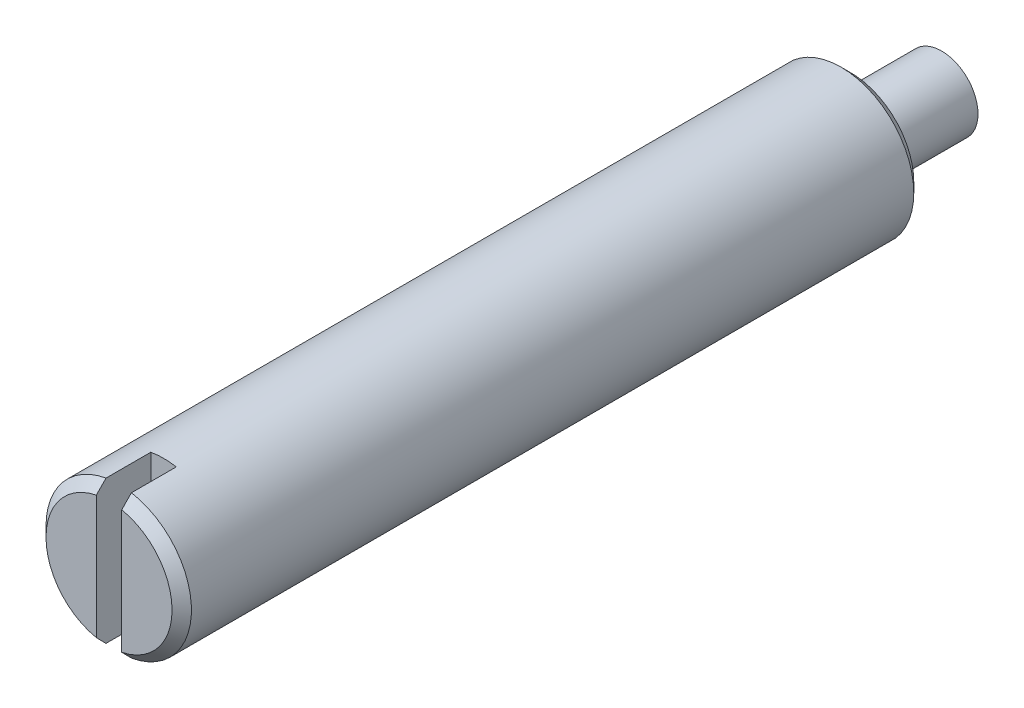
ISO-10303-21;
HEADER;
FILE_DESCRIPTION(('STEP AP214'),'2;1');
FILE_NAME('part.step','',(''),(''),'','','');
FILE_SCHEMA(('AUTOMOTIVE_DESIGN { 1 0 10303 214 1 1 1 1 }'));
ENDSEC;
DATA;
#1=APPLICATION_CONTEXT('core data for automotive mechanical design processes');
#2=APPLICATION_PROTOCOL_DEFINITION('international standard','automotive_design',2000,#1);
#3=PRODUCT_CONTEXT('',#1,'mechanical');
#4=PRODUCT('Part','Part','',(#3));
#5=PRODUCT_RELATED_PRODUCT_CATEGORY('part','',(#4));
#6=PRODUCT_DEFINITION_FORMATION('','',#4);
#7=PRODUCT_DEFINITION_CONTEXT('part definition',#1,'design');
#8=PRODUCT_DEFINITION('design','',#6,#7);
#9=PRODUCT_DEFINITION_SHAPE('','',#8);
#10=(LENGTH_UNIT() NAMED_UNIT(*) SI_UNIT(.MILLI.,.METRE.));
#11=(NAMED_UNIT(*) PLANE_ANGLE_UNIT() SI_UNIT($,.RADIAN.));
#12=(NAMED_UNIT(*) SI_UNIT($,.STERADIAN.) SOLID_ANGLE_UNIT());
#13=UNCERTAINTY_MEASURE_WITH_UNIT(LENGTH_MEASURE(1.E-05),#10,'distance_accuracy_value','');
#14=(GEOMETRIC_REPRESENTATION_CONTEXT(3) GLOBAL_UNCERTAINTY_ASSIGNED_CONTEXT((#13)) GLOBAL_UNIT_ASSIGNED_CONTEXT((#10,
#11,#12)) REPRESENTATION_CONTEXT('',''));
#15=CARTESIAN_POINT('',(0.,0.,0.));
#16=DIRECTION('',(0.,0.,1.));
#17=DIRECTION('',(1.,0.,0.));
#18=AXIS2_PLACEMENT_3D('',#15,#16,#17);
#19=CARTESIAN_POINT('',(0.,0.,-25.4));
#20=DIRECTION('',(0.,0.,-1.));
#21=DIRECTION('',(-1.,0.,0.));
#22=AXIS2_PLACEMENT_3D('',#19,#20,#21);
#23=PLANE('',#22);
#24=CARTESIAN_POINT('',(0.,0.,-25.4));
#25=DIRECTION('',(0.,0.,1.));
#26=DIRECTION('',(1.,0.,0.));
#27=AXIS2_PLACEMENT_3D('',#24,#25,#26);
#28=CIRCLE('',#27,2.);
#29=CARTESIAN_POINT('',(2.,0.,-25.4));
#30=VERTEX_POINT('',#29);
#31=EDGE_CURVE('E19',#30,#30,#28,.T.);
#32=ORIENTED_EDGE('',*,*,#31,.F.);
#33=EDGE_LOOP('',(#32));
#34=FACE_BOUND('',#33,.T.);
#35=ADVANCED_FACE('F16',(#34),#23,.T.);
#36=CARTESIAN_POINT('',(0.,0.,-25.4));
#37=DIRECTION('',(0.,0.,1.));
#38=DIRECTION('',(1.,0.,0.));
#39=AXIS2_PLACEMENT_3D('',#36,#37,#38);
#40=CYLINDRICAL_SURFACE('',#39,2.);
#41=ORIENTED_EDGE('',*,*,#31,.T.);
#42=EDGE_LOOP('',(#41));
#43=FACE_BOUND('',#42,.T.);
#44=CARTESIAN_POINT('',(0.,0.,-20.4));
#45=DIRECTION('',(0.,0.,1.));
#46=DIRECTION('',(1.,0.,0.));
#47=AXIS2_PLACEMENT_3D('',#44,#45,#46);
#48=CIRCLE('',#47,2.);
#49=CARTESIAN_POINT('',(2.,0.,-20.4));
#50=VERTEX_POINT('',#49);
#51=EDGE_CURVE('E192',#50,#50,#48,.F.);
#52=ORIENTED_EDGE('',*,*,#51,.T.);
#53=EDGE_LOOP('',(#52));
#54=FACE_BOUND('',#53,.T.);
#55=ADVANCED_FACE('F151',(#43,#54),#40,.T.);
#56=CARTESIAN_POINT('',(0.,0.,-20.4));
#57=DIRECTION('',(0.,0.,1.));
#58=DIRECTION('',(1.,0.,0.));
#59=AXIS2_PLACEMENT_3D('',#56,#57,#58);
#60=PLANE('',#59);
#61=ORIENTED_EDGE('',*,*,#51,.F.);
#62=EDGE_LOOP('',(#61));
#63=FACE_BOUND('',#62,.T.);
#64=CARTESIAN_POINT('',(0.,0.,-20.3999999999951));
#65=DIRECTION('',(0.,0.,1.));
#66=DIRECTION('',(1.,0.,0.));
#67=AXIS2_PLACEMENT_3D('',#64,#65,#66);
#68=CIRCLE('',#67,3.46666666666806);
#69=CARTESIAN_POINT('',(3.46666666666806,0.,-20.3999999999951));
#70=VERTEX_POINT('',#69);
#71=EDGE_CURVE('E94',#70,#70,#68,.T.);
#72=ORIENTED_EDGE('',*,*,#71,.F.);
#73=EDGE_LOOP('',(#72));
#74=FACE_BOUND('',#73,.T.);
#75=ADVANCED_FACE('F149',(#63,#74),#60,.F.);
#76=CARTESIAN_POINT('',(0.,0.,20.4));
#77=DIRECTION('',(0.,0.,1.));
#78=DIRECTION('',(1.,0.,0.));
#79=AXIS2_PLACEMENT_3D('',#76,#77,#78);
#80=PLANE('',#79);
#81=CARTESIAN_POINT('',(0.,0.,20.3999999999951));
#82=DIRECTION('',(0.,0.,-1.));
#83=DIRECTION('',(-1.,0.,0.));
#84=AXIS2_PLACEMENT_3D('',#81,#82,#83);
#85=CIRCLE('',#84,3.46666666666806);
#86=CARTESIAN_POINT('',(-0.699999999999999,-3.39525813124467,20.3999999999957));
#87=VERTEX_POINT('',#86);
#88=CARTESIAN_POINT('',(-0.699999999999999,3.39525813124281,20.3999999999975));
#89=VERTEX_POINT('',#88);
#90=EDGE_CURVE('E93',#87,#89,#85,.T.);
#91=ORIENTED_EDGE('',*,*,#90,.F.);
#92=DIRECTION('',(0.,1.,0.));
#93=VECTOR('',#92,1.);
#94=CARTESIAN_POINT('',(-0.699999999999999,10.,20.4));
#95=LINE('',#94,#93);
#96=EDGE_CURVE('E83',#87,#89,#95,.T.);
#97=ORIENTED_EDGE('',*,*,#96,.T.);
#98=EDGE_LOOP('',(#91,#97));
#99=FACE_BOUND('',#98,.T.);
#100=ADVANCED_FACE('F146',(#99),#80,.T.);
#101=CARTESIAN_POINT('',(0.699999999999999,10.,17.4));
#102=DIRECTION('',(0.,0.,-1.));
#103=DIRECTION('',(-1.,0.,0.));
#104=AXIS2_PLACEMENT_3D('',#101,#102,#103);
#105=PLANE('',#104);
#106=CARTESIAN_POINT('',(0.,0.,17.4));
#107=DIRECTION('',(0.,0.,-1.));
#108=DIRECTION('',(-1.,0.,0.));
#109=AXIS2_PLACEMENT_3D('',#106,#107,#108);
#110=CIRCLE('',#109,4.);
#111=CARTESIAN_POINT('',(0.699999999999999,-3.93827373350304,17.4));
#112=VERTEX_POINT('',#111);
#113=CARTESIAN_POINT('',(-0.699999999999999,-3.93827373350304,17.4));
#114=VERTEX_POINT('',#113);
#115=EDGE_CURVE('E86',#112,#114,#110,.T.);
#116=ORIENTED_EDGE('',*,*,#115,.F.);
#117=DIRECTION('',(0.,1.,0.));
#118=VECTOR('',#117,1.);
#119=CARTESIAN_POINT('',(0.699999999999999,10.,17.4));
#120=LINE('',#119,#118);
#121=CARTESIAN_POINT('',(0.699999999999999,3.93827373350304,17.4));
#122=VERTEX_POINT('',#121);
#123=EDGE_CURVE('E89',#112,#122,#120,.T.);
#124=ORIENTED_EDGE('',*,*,#123,.T.);
#125=CARTESIAN_POINT('',(0.,0.,17.4));
#126=DIRECTION('',(0.,0.,-1.));
#127=DIRECTION('',(-1.,0.,0.));
#128=AXIS2_PLACEMENT_3D('',#125,#126,#127);
#129=CIRCLE('',#128,4.);
#130=CARTESIAN_POINT('',(-0.7,3.93827373350304,17.4));
#131=VERTEX_POINT('',#130);
#132=EDGE_CURVE('E33',#131,#122,#129,.T.);
#133=ORIENTED_EDGE('',*,*,#132,.F.);
#134=DIRECTION('',(0.,1.,0.));
#135=VECTOR('',#134,1.);
#136=CARTESIAN_POINT('',(-0.699999999999999,10.,17.4));
#137=LINE('',#136,#135);
#138=EDGE_CURVE('E54',#131,#114,#137,.F.);
#139=ORIENTED_EDGE('',*,*,#138,.T.);
#140=EDGE_LOOP('',(#116,#124,#133,#139));
#141=FACE_BOUND('',#140,.T.);
#142=ADVANCED_FACE('F87',(#141),#105,.F.);
#143=CARTESIAN_POINT('',(0.,0.,20.4));
#144=DIRECTION('',(0.,0.,1.));
#145=DIRECTION('',(1.,0.,0.));
#146=AXIS2_PLACEMENT_3D('',#143,#144,#145);
#147=PLANE('',#146);
#148=DIRECTION('',(0.,1.,0.));
#149=VECTOR('',#148,1.);
#150=CARTESIAN_POINT('',(0.699999999999999,10.,20.4));
#151=LINE('',#150,#149);
#152=CARTESIAN_POINT('',(0.699999999999999,3.39525813124404,20.3999999999963));
#153=VERTEX_POINT('',#152);
#154=CARTESIAN_POINT('',(0.699999999999999,-3.39525813124281,20.3999999999975));
#155=VERTEX_POINT('',#154);
#156=EDGE_CURVE('E67',#153,#155,#151,.F.);
#157=ORIENTED_EDGE('',*,*,#156,.T.);
#158=CARTESIAN_POINT('',(0.,0.,20.3999999999951));
#159=DIRECTION('',(0.,0.,-1.));
#160=DIRECTION('',(-1.,0.,0.));
#161=AXIS2_PLACEMENT_3D('',#158,#159,#160);
#162=CIRCLE('',#161,3.46666666666806);
#163=EDGE_CURVE('E181',#153,#155,#162,.T.);
#164=ORIENTED_EDGE('',*,*,#163,.F.);
#165=EDGE_LOOP('',(#157,#164));
#166=FACE_BOUND('',#165,.T.);
#167=ADVANCED_FACE('F139',(#166),#147,.T.);
#168=CARTESIAN_POINT('',(0.,0.,19.8666666667577));
#169=DIRECTION('',(0.,0.,-1.));
#170=DIRECTION('',(-1.,0.,0.));
#171=AXIS2_PLACEMENT_3D('',#168,#169,#170);
#172=CONICAL_SURFACE('',#171,3.99999999990541,0.785398163397448);
#173=CARTESIAN_POINT('',(0.699999999999999,3.93827373349015,19.8666666666758));
#174=CARTESIAN_POINT('',(0.699999999999999,3.84788742853606,19.9556739567061));
#175=CARTESIAN_POINT('',(0.699999999999999,3.75744297725673,20.0446220448079));
#176=CARTESIAN_POINT('',(0.699999999999999,3.57643777651471,20.2223998225891));
#177=CARTESIAN_POINT('',(0.699999999999999,3.48587702704491,20.3112295122612));
#178=CARTESIAN_POINT('',(0.699999999999999,3.39525813124276,20.3999999999976));
#179=B_SPLINE_CURVE_WITH_KNOTS('',3,(#173,#174,#175,#176,#177,#178),.UNSPECIFIED.,.F.,.F.,(4,2,
4),(0.,0.380562281759168,0.761124586784123),.UNSPECIFIED.);
#180=CARTESIAN_POINT('',(0.699999999999999,3.9382737334966,19.8666666666712));
#181=VERTEX_POINT('',#180);
#182=EDGE_CURVE('E104',#181,#153,#179,.T.);
#183=ORIENTED_EDGE('',*,*,#182,.T.);
#184=ORIENTED_EDGE('',*,*,#163,.T.);
#185=CARTESIAN_POINT('',(0.699999999999999,-3.39525813124347,20.3999999999969));
#186=CARTESIAN_POINT('',(0.699999999999999,-3.48587702704549,20.3112295122606));
#187=CARTESIAN_POINT('',(0.699999999999999,-3.57643777651518,20.2223998225886));
#188=CARTESIAN_POINT('',(0.699999999999999,-3.75744297725696,20.0446220448077));
#189=CARTESIAN_POINT('',(0.699999999999999,-3.84788742853617,19.955673956706));
#190=CARTESIAN_POINT('',(0.699999999999999,-3.93827373349015,19.8666666666758));
#191=B_SPLINE_CURVE_WITH_KNOTS('',3,(#185,#186,#187,#188,#189,#190),.UNSPECIFIED.,.F.,.F.,(4,2,
4),(0.,0.380562305024464,0.761124586783139),.UNSPECIFIED.);
#192=CARTESIAN_POINT('',(0.699999999999999,-3.9382737334966,19.8666666666712));
#193=VERTEX_POINT('',#192);
#194=EDGE_CURVE('E118',#155,#193,#191,.T.);
#195=ORIENTED_EDGE('',*,*,#194,.T.);
#196=CARTESIAN_POINT('',(0.,0.,19.8666666666667));
#197=DIRECTION('',(0.,0.,-1.));
#198=DIRECTION('',(-1.,0.,0.));
#199=AXIS2_PLACEMENT_3D('',#196,#197,#198);
#200=CIRCLE('',#199,4.);
#201=EDGE_CURVE('E75',#181,#193,#200,.T.);
#202=ORIENTED_EDGE('',*,*,#201,.F.);
#203=EDGE_LOOP('',(#183,#184,#195,#202));
#204=FACE_BOUND('',#203,.T.);
#205=ADVANCED_FACE('F133',(#204),#172,.T.);
#206=CARTESIAN_POINT('',(0.,0.,-19.8666666667577));
#207=DIRECTION('',(0.,0.,1.));
#208=DIRECTION('',(1.,0.,0.));
#209=AXIS2_PLACEMENT_3D('',#206,#207,#208);
#210=CONICAL_SURFACE('',#209,3.99999999984857,0.785398163344158);
#211=CARTESIAN_POINT('',(0.,0.,-19.8666666666667));
#212=DIRECTION('',(0.,0.,-1.));
#213=DIRECTION('',(-1.,0.,0.));
#214=AXIS2_PLACEMENT_3D('',#211,#212,#213);
#215=CIRCLE('',#214,4.);
#216=CARTESIAN_POINT('',(-4.,0.,-19.8666666666667));
#217=VERTEX_POINT('',#216);
#218=EDGE_CURVE('E113',#217,#217,#215,.F.);
#219=ORIENTED_EDGE('',*,*,#218,.F.);
#220=EDGE_LOOP('',(#219));
#221=FACE_BOUND('',#220,.T.);
#222=ORIENTED_EDGE('',*,*,#71,.T.);
#223=EDGE_LOOP('',(#222));
#224=FACE_BOUND('',#223,.T.);
#225=ADVANCED_FACE('F138',(#221,#224),#210,.T.);
#226=CARTESIAN_POINT('',(0.,0.,19.8666666667577));
#227=DIRECTION('',(0.,0.,-1.));
#228=DIRECTION('',(-1.,0.,0.));
#229=AXIS2_PLACEMENT_3D('',#226,#227,#228);
#230=CONICAL_SURFACE('',#229,3.99999999990541,0.785398163397448);
#231=CARTESIAN_POINT('',(-0.699999999999999,3.39525813124347,20.3999999999969));
#232=CARTESIAN_POINT('',(-0.699999999999999,3.48587702704549,20.3112295122606));
#233=CARTESIAN_POINT('',(-0.699999999999999,3.57643777651518,20.2223998225886));
#234=CARTESIAN_POINT('',(-0.699999999999999,3.75744297725696,20.0446220448077));
#235=CARTESIAN_POINT('',(-0.699999999999999,3.84788742853617,19.955673956706));
#236=CARTESIAN_POINT('',(-0.699999999999999,3.93827373349015,19.8666666666758));
#237=B_SPLINE_CURVE_WITH_KNOTS('',3,(#231,#232,#233,#234,#235,#236),.UNSPECIFIED.,.F.,.F.,(4,2,
4),(0.,0.380562305024464,0.761124586783139),.UNSPECIFIED.);
#238=CARTESIAN_POINT('',(-0.7,3.9382737334966,19.8666666666712));
#239=VERTEX_POINT('',#238);
#240=EDGE_CURVE('E101',#89,#239,#237,.T.);
#241=ORIENTED_EDGE('',*,*,#240,.T.);
#242=CARTESIAN_POINT('',(0.,0.,19.8666666666667));
#243=DIRECTION('',(0.,0.,-1.));
#244=DIRECTION('',(-1.,0.,0.));
#245=AXIS2_PLACEMENT_3D('',#242,#243,#244);
#246=CIRCLE('',#245,4.);
#247=CARTESIAN_POINT('',(-0.699999999999999,-3.93827373349317,19.8666666666746));
#248=VERTEX_POINT('',#247);
#249=EDGE_CURVE('E45',#248,#239,#246,.T.);
#250=ORIENTED_EDGE('',*,*,#249,.F.);
#251=CARTESIAN_POINT('',(-0.699999999999999,-3.9382737334833,19.8666666666826));
#252=CARTESIAN_POINT('',(-0.699999999999999,-3.84788742853055,19.9556739567115));
#253=CARTESIAN_POINT('',(-0.699999999999999,-3.75744297725258,20.044622044812));
#254=CARTESIAN_POINT('',(-0.699999999999999,-3.57643777651326,20.2223998225905));
#255=CARTESIAN_POINT('',(-0.699999999999999,-3.48587702704481,20.3112295122613));
#256=CARTESIAN_POINT('',(-0.699999999999999,-3.39525813124403,20.3999999999963));
#257=B_SPLINE_CURVE_WITH_KNOTS('',3,(#251,#252,#253,#254,#255,#256),.UNSPECIFIED.,.F.,.F.,(4,2,
4),(0.,0.380562281753469,0.761124586772728),.UNSPECIFIED.);
#258=EDGE_CURVE('E187',#248,#87,#257,.T.);
#259=ORIENTED_EDGE('',*,*,#258,.T.);
#260=ORIENTED_EDGE('',*,*,#90,.T.);
#261=EDGE_LOOP('',(#241,#250,#259,#260));
#262=FACE_BOUND('',#261,.T.);
#263=ADVANCED_FACE('F177',(#262),#230,.T.);
#264=CARTESIAN_POINT('',(-0.699999999999999,10.,17.4));
#265=DIRECTION('',(-1.,0.,0.));
#266=DIRECTION('',(0.,0.,1.));
#267=AXIS2_PLACEMENT_3D('',#264,#265,#266);
#268=PLANE('',#267);
#269=ORIENTED_EDGE('',*,*,#96,.F.);
#270=ORIENTED_EDGE('',*,*,#258,.F.);
#271=DIRECTION('',(0.,0.,1.));
#272=VECTOR('',#271,1.);
#273=CARTESIAN_POINT('',(-0.699999999999999,-3.93827373350304,17.4));
#274=LINE('',#273,#272);
#275=EDGE_CURVE('E110',#114,#248,#274,.T.);
#276=ORIENTED_EDGE('',*,*,#275,.F.);
#277=ORIENTED_EDGE('',*,*,#138,.F.);
#278=DIRECTION('',(0.,0.,-1.));
#279=VECTOR('',#278,1.);
#280=CARTESIAN_POINT('',(-0.7,3.93827373350304,20.4));
#281=LINE('',#280,#279);
#282=EDGE_CURVE('E25',#239,#131,#281,.T.);
#283=ORIENTED_EDGE('',*,*,#282,.F.);
#284=ORIENTED_EDGE('',*,*,#240,.F.);
#285=EDGE_LOOP('',(#269,#270,#276,#277,#283,#284));
#286=FACE_BOUND('',#285,.T.);
#287=ADVANCED_FACE('F167',(#286),#268,.F.);
#288=CARTESIAN_POINT('',(0.699999999999999,10.,17.4));
#289=DIRECTION('',(1.,0.,0.));
#290=DIRECTION('',(0.,0.,-1.));
#291=AXIS2_PLACEMENT_3D('',#288,#289,#290);
#292=PLANE('',#291);
#293=ORIENTED_EDGE('',*,*,#156,.F.);
#294=ORIENTED_EDGE('',*,*,#182,.F.);
#295=DIRECTION('',(0.,0.,-1.));
#296=VECTOR('',#295,1.);
#297=CARTESIAN_POINT('',(0.699999999999999,3.93827373350304,20.4));
#298=LINE('',#297,#296);
#299=EDGE_CURVE('E11',#122,#181,#298,.F.);
#300=ORIENTED_EDGE('',*,*,#299,.F.);
#301=ORIENTED_EDGE('',*,*,#123,.F.);
#302=DIRECTION('',(0.,0.,-1.));
#303=VECTOR('',#302,1.);
#304=CARTESIAN_POINT('',(0.699999999999999,-3.93827373350304,17.4));
#305=LINE('',#304,#303);
#306=EDGE_CURVE('E97',#193,#112,#305,.T.);
#307=ORIENTED_EDGE('',*,*,#306,.F.);
#308=ORIENTED_EDGE('',*,*,#194,.F.);
#309=EDGE_LOOP('',(#293,#294,#300,#301,#307,#308));
#310=FACE_BOUND('',#309,.T.);
#311=ADVANCED_FACE('F103',(#310),#292,.F.);
#312=CARTESIAN_POINT('',(0.,0.,20.4));
#313=DIRECTION('',(0.,0.,-1.));
#314=DIRECTION('',(-1.,0.,0.));
#315=AXIS2_PLACEMENT_3D('',#312,#313,#314);
#316=CYLINDRICAL_SURFACE('',#315,4.);
#317=ORIENTED_EDGE('',*,*,#218,.T.);
#318=EDGE_LOOP('',(#317));
#319=FACE_BOUND('',#318,.T.);
#320=ORIENTED_EDGE('',*,*,#132,.T.);
#321=ORIENTED_EDGE('',*,*,#299,.T.);
#322=ORIENTED_EDGE('',*,*,#201,.T.);
#323=ORIENTED_EDGE('',*,*,#306,.T.);
#324=ORIENTED_EDGE('',*,*,#115,.T.);
#325=ORIENTED_EDGE('',*,*,#275,.T.);
#326=ORIENTED_EDGE('',*,*,#249,.T.);
#327=ORIENTED_EDGE('',*,*,#282,.T.);
#328=EDGE_LOOP('',(#320,#321,#322,#323,#324,#325,#326,#327));
#329=FACE_BOUND('',#328,.T.);
#330=ADVANCED_FACE('F98',(#319,#329),#316,.T.);
#331=CLOSED_SHELL('',(#35,#55,#75,#100,#142,#167,#205,#225,#263,#287,#311,#330));
#332=MANIFOLD_SOLID_BREP('B1',#331);
#333=ADVANCED_BREP_SHAPE_REPRESENTATION('',(#18,#332),#14);
#334=SHAPE_DEFINITION_REPRESENTATION(#9,#333);
ENDSEC;
END-ISO-10303-21;
